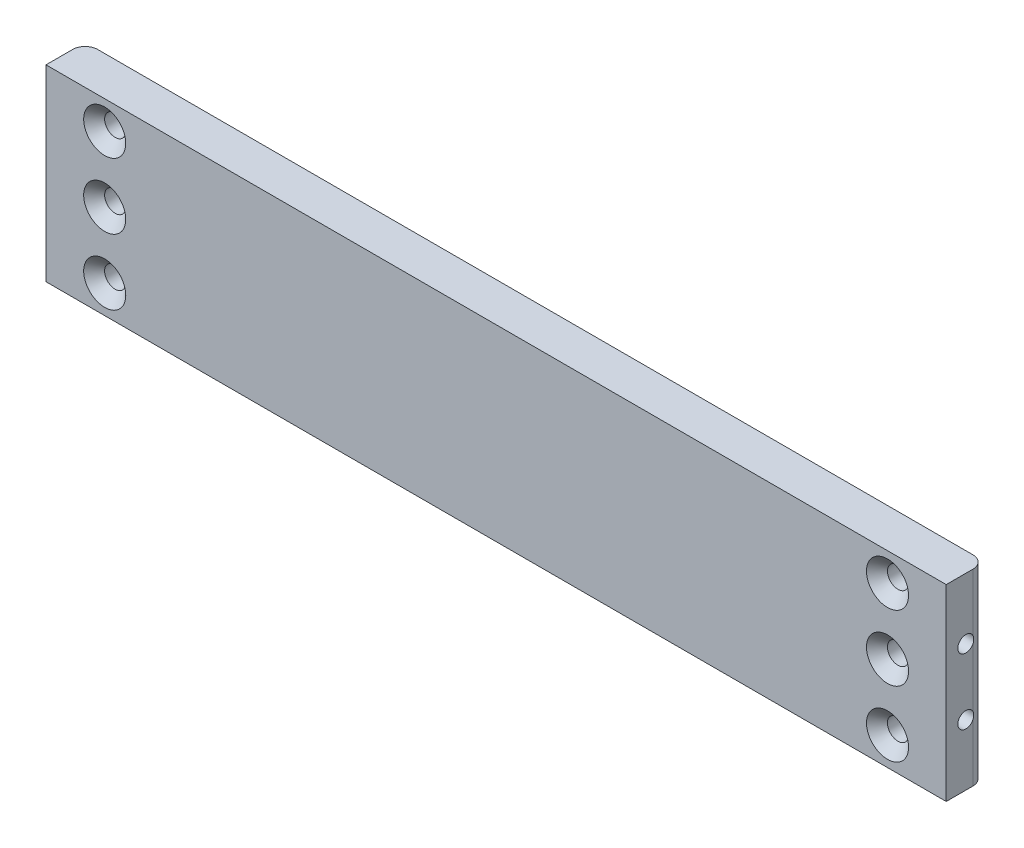
ISO-10303-21;
HEADER;
FILE_DESCRIPTION(('STEP AP214'),'2;1');
FILE_NAME('part.step','',(''),(''),'','','');
FILE_SCHEMA(('AUTOMOTIVE_DESIGN { 1 0 10303 214 1 1 1 1 }'));
ENDSEC;
DATA;
#1=APPLICATION_CONTEXT('core data for automotive mechanical design processes');
#2=APPLICATION_PROTOCOL_DEFINITION('international standard','automotive_design',2000,#1);
#3=PRODUCT_CONTEXT('',#1,'mechanical');
#4=PRODUCT('Part','Part','',(#3));
#5=PRODUCT_RELATED_PRODUCT_CATEGORY('part','',(#4));
#6=PRODUCT_DEFINITION_FORMATION('','',#4);
#7=PRODUCT_DEFINITION_CONTEXT('part definition',#1,'design');
#8=PRODUCT_DEFINITION('design','',#6,#7);
#9=PRODUCT_DEFINITION_SHAPE('','',#8);
#10=(LENGTH_UNIT() NAMED_UNIT(*) SI_UNIT(.MILLI.,.METRE.));
#11=(NAMED_UNIT(*) PLANE_ANGLE_UNIT() SI_UNIT($,.RADIAN.));
#12=(NAMED_UNIT(*) SI_UNIT($,.STERADIAN.) SOLID_ANGLE_UNIT());
#13=UNCERTAINTY_MEASURE_WITH_UNIT(LENGTH_MEASURE(1.E-05),#10,'distance_accuracy_value','');
#14=(GEOMETRIC_REPRESENTATION_CONTEXT(3) GLOBAL_UNCERTAINTY_ASSIGNED_CONTEXT((#13)) GLOBAL_UNIT_ASSIGNED_CONTEXT((#10,
#11,#12)) REPRESENTATION_CONTEXT('',''));
#15=CARTESIAN_POINT('',(0.,0.,0.));
#16=DIRECTION('',(0.,0.,1.));
#17=DIRECTION('',(1.,0.,0.));
#18=AXIS2_PLACEMENT_3D('',#15,#16,#17);
#19=CARTESIAN_POINT('',(-50.,120.,25.));
#20=DIRECTION('',(1.,0.,0.));
#21=DIRECTION('',(0.,0.,-1.));
#22=AXIS2_PLACEMENT_3D('',#19,#20,#21);
#23=PLANE('',#22);
#24=DIRECTION('',(0.,0.,-1.));
#25=VECTOR('',#24,1.);
#26=CARTESIAN_POINT('',(-50.,120.,25.));
#27=LINE('',#26,#25);
#28=CARTESIAN_POINT('',(-50.,120.,25.));
#29=VERTEX_POINT('',#28);
#30=CARTESIAN_POINT('',(-50.,120.,8.));
#31=VERTEX_POINT('',#30);
#32=EDGE_CURVE('E283',#29,#31,#27,.T.);
#33=ORIENTED_EDGE('',*,*,#32,.T.);
#34=DIRECTION('',(0.,-1.,0.));
#35=VECTOR('',#34,1.);
#36=CARTESIAN_POINT('',(-50.,120.,8.));
#37=LINE('',#36,#35);
#38=CARTESIAN_POINT('',(-50.,83.3999999999999,8.));
#39=VERTEX_POINT('',#38);
#40=EDGE_CURVE('E347',#31,#39,#37,.T.);
#41=ORIENTED_EDGE('',*,*,#40,.T.);
#42=CARTESIAN_POINT('',(-50.,80.9999999999999,12.5));
#43=DIRECTION('',(-1.,0.,0.));
#44=DIRECTION('',(0.,0.,1.));
#45=AXIS2_PLACEMENT_3D('',#42,#43,#44);
#46=CIRCLE('',#45,5.09999999999999);
#47=CARTESIAN_POINT('',(-50.,78.6,8.));
#48=VERTEX_POINT('',#47);
#49=EDGE_CURVE('E162',#48,#39,#46,.T.);
#50=ORIENTED_EDGE('',*,*,#49,.F.);
#51=DIRECTION('',(0.,-1.,0.));
#52=VECTOR('',#51,1.);
#53=CARTESIAN_POINT('',(-50.,120.,8.));
#54=LINE('',#53,#52);
#55=CARTESIAN_POINT('',(-50.,41.4,8.));
#56=VERTEX_POINT('',#55);
#57=EDGE_CURVE('E70',#48,#56,#54,.T.);
#58=ORIENTED_EDGE('',*,*,#57,.T.);
#59=CARTESIAN_POINT('',(-50.,39.,12.5));
#60=DIRECTION('',(-1.,0.,0.));
#61=DIRECTION('',(0.,0.,1.));
#62=AXIS2_PLACEMENT_3D('',#59,#60,#61);
#63=CIRCLE('',#62,5.09999999999999);
#64=CARTESIAN_POINT('',(-50.,36.6,8.));
#65=VERTEX_POINT('',#64);
#66=EDGE_CURVE('E170',#65,#56,#63,.T.);
#67=ORIENTED_EDGE('',*,*,#66,.F.);
#68=DIRECTION('',(0.,-1.,0.));
#69=VECTOR('',#68,1.);
#70=CARTESIAN_POINT('',(-50.,120.,8.));
#71=LINE('',#70,#69);
#72=CARTESIAN_POINT('',(-50.,0.,8.));
#73=VERTEX_POINT('',#72);
#74=EDGE_CURVE('E353',#65,#73,#71,.T.);
#75=ORIENTED_EDGE('',*,*,#74,.T.);
#76=DIRECTION('',(0.,0.,-1.));
#77=VECTOR('',#76,1.);
#78=CARTESIAN_POINT('',(-50.,0.,25.));
#79=LINE('',#78,#77);
#80=CARTESIAN_POINT('',(-50.,0.,25.));
#81=VERTEX_POINT('',#80);
#82=EDGE_CURVE('E279',#81,#73,#79,.T.);
#83=ORIENTED_EDGE('',*,*,#82,.F.);
#84=DIRECTION('',(0.,-1.,0.));
#85=VECTOR('',#84,1.);
#86=CARTESIAN_POINT('',(-50.,120.,25.));
#87=LINE('',#86,#85);
#88=EDGE_CURVE('E254',#29,#81,#87,.T.);
#89=ORIENTED_EDGE('',*,*,#88,.F.);
#90=EDGE_LOOP('',(#33,#41,#50,#58,#67,#75,#83,#89));
#91=FACE_BOUND('',#90,.T.);
#92=ADVANCED_FACE('F44',(#91),#23,.F.);
#93=CARTESIAN_POINT('',(525.,0.,25.));
#94=DIRECTION('',(0.,-1.,0.));
#95=DIRECTION('',(1.,0.,0.));
#96=AXIS2_PLACEMENT_3D('',#93,#94,#95);
#97=PLANE('',#96);
#98=DIRECTION('',(-1.,0.,0.));
#99=VECTOR('',#98,1.);
#100=CARTESIAN_POINT('',(525.,0.,0.));
#101=LINE('',#100,#99);
#102=CARTESIAN_POINT('',(517.,0.,0.));
#103=VERTEX_POINT('',#102);
#104=CARTESIAN_POINT('',(-42.,0.,0.));
#105=VERTEX_POINT('',#104);
#106=EDGE_CURVE('E249',#103,#105,#101,.T.);
#107=ORIENTED_EDGE('',*,*,#106,.F.);
#108=CARTESIAN_POINT('',(517.,0.,8.));
#109=DIRECTION('',(0.,-1.,0.));
#110=DIRECTION('',(1.,0.,0.));
#111=AXIS2_PLACEMENT_3D('',#108,#109,#110);
#112=CIRCLE('',#111,8.);
#113=CARTESIAN_POINT('',(525.,0.,8.));
#114=VERTEX_POINT('',#113);
#115=EDGE_CURVE('E297',#103,#114,#112,.T.);
#116=ORIENTED_EDGE('',*,*,#115,.T.);
#117=DIRECTION('',(0.,0.,-1.));
#118=VECTOR('',#117,1.);
#119=CARTESIAN_POINT('',(525.,0.,25.));
#120=LINE('',#119,#118);
#121=CARTESIAN_POINT('',(525.,0.,25.));
#122=VERTEX_POINT('',#121);
#123=EDGE_CURVE('E275',#122,#114,#120,.T.);
#124=ORIENTED_EDGE('',*,*,#123,.F.);
#125=DIRECTION('',(1.,0.,0.));
#126=VECTOR('',#125,1.);
#127=CARTESIAN_POINT('',(-50.,0.,25.));
#128=LINE('',#127,#126);
#129=EDGE_CURVE('E258',#81,#122,#128,.T.);
#130=ORIENTED_EDGE('',*,*,#129,.F.);
#131=ORIENTED_EDGE('',*,*,#82,.T.);
#132=CARTESIAN_POINT('',(-42.,0.,8.));
#133=DIRECTION('',(0.,-1.,0.));
#134=DIRECTION('',(1.,0.,0.));
#135=AXIS2_PLACEMENT_3D('',#132,#133,#134);
#136=CIRCLE('',#135,8.);
#137=EDGE_CURVE('E294',#73,#105,#136,.T.);
#138=ORIENTED_EDGE('',*,*,#137,.T.);
#139=EDGE_LOOP('',(#107,#116,#124,#130,#131,#138));
#140=FACE_BOUND('',#139,.T.);
#141=ADVANCED_FACE('F395',(#140),#97,.T.);
#142=CARTESIAN_POINT('',(525.,120.,25.));
#143=DIRECTION('',(1.,0.,0.));
#144=DIRECTION('',(0.,0.,-1.));
#145=AXIS2_PLACEMENT_3D('',#142,#143,#144);
#146=PLANE('',#145);
#147=ORIENTED_EDGE('',*,*,#123,.T.);
#148=DIRECTION('',(0.,-1.,0.));
#149=VECTOR('',#148,1.);
#150=CARTESIAN_POINT('',(525.,120.,8.));
#151=LINE('',#150,#149);
#152=CARTESIAN_POINT('',(525.,36.6,8.));
#153=VERTEX_POINT('',#152);
#154=EDGE_CURVE('E306',#114,#153,#151,.F.);
#155=ORIENTED_EDGE('',*,*,#154,.T.);
#156=CARTESIAN_POINT('',(525.,39.,12.5));
#157=DIRECTION('',(1.,0.,0.));
#158=DIRECTION('',(0.,0.,-1.));
#159=AXIS2_PLACEMENT_3D('',#156,#157,#158);
#160=CIRCLE('',#159,5.09999999999999);
#161=CARTESIAN_POINT('',(525.,41.4,8.));
#162=VERTEX_POINT('',#161);
#163=EDGE_CURVE('E148',#162,#153,#160,.T.);
#164=ORIENTED_EDGE('',*,*,#163,.F.);
#165=DIRECTION('',(0.,-1.,0.));
#166=VECTOR('',#165,1.);
#167=CARTESIAN_POINT('',(525.,120.,8.));
#168=LINE('',#167,#166);
#169=CARTESIAN_POINT('',(525.,78.6,8.));
#170=VERTEX_POINT('',#169);
#171=EDGE_CURVE('E303',#162,#170,#168,.F.);
#172=ORIENTED_EDGE('',*,*,#171,.T.);
#173=CARTESIAN_POINT('',(525.,80.9999999999999,12.5));
#174=DIRECTION('',(1.,0.,0.));
#175=DIRECTION('',(0.,0.,-1.));
#176=AXIS2_PLACEMENT_3D('',#173,#174,#175);
#177=CIRCLE('',#176,5.09999999999999);
#178=CARTESIAN_POINT('',(525.,83.3999999999999,8.));
#179=VERTEX_POINT('',#178);
#180=EDGE_CURVE('E149',#179,#170,#177,.T.);
#181=ORIENTED_EDGE('',*,*,#180,.F.);
#182=DIRECTION('',(0.,-1.,0.));
#183=VECTOR('',#182,1.);
#184=CARTESIAN_POINT('',(525.,120.,8.));
#185=LINE('',#184,#183);
#186=CARTESIAN_POINT('',(525.,120.,8.));
#187=VERTEX_POINT('',#186);
#188=EDGE_CURVE('E300',#179,#187,#185,.F.);
#189=ORIENTED_EDGE('',*,*,#188,.T.);
#190=DIRECTION('',(0.,0.,-1.));
#191=VECTOR('',#190,1.);
#192=CARTESIAN_POINT('',(525.,120.,25.));
#193=LINE('',#192,#191);
#194=CARTESIAN_POINT('',(525.,120.,25.));
#195=VERTEX_POINT('',#194);
#196=EDGE_CURVE('E265',#195,#187,#193,.T.);
#197=ORIENTED_EDGE('',*,*,#196,.F.);
#198=DIRECTION('',(0.,-1.,0.));
#199=VECTOR('',#198,1.);
#200=CARTESIAN_POINT('',(525.,120.,25.));
#201=LINE('',#200,#199);
#202=EDGE_CURVE('E261',#195,#122,#201,.T.);
#203=ORIENTED_EDGE('',*,*,#202,.T.);
#204=EDGE_LOOP('',(#147,#155,#164,#172,#181,#189,#197,#203));
#205=FACE_BOUND('',#204,.T.);
#206=ADVANCED_FACE('F372',(#205),#146,.T.);
#207=CARTESIAN_POINT('',(-25.,120.,25.));
#208=DIRECTION('',(0.,1.,0.));
#209=DIRECTION('',(-1.,0.,0.));
#210=AXIS2_PLACEMENT_3D('',#207,#208,#209);
#211=PLANE('',#210);
#212=ORIENTED_EDGE('',*,*,#196,.T.);
#213=CARTESIAN_POINT('',(517.,120.,8.));
#214=DIRECTION('',(0.,1.,0.));
#215=DIRECTION('',(-1.,0.,0.));
#216=AXIS2_PLACEMENT_3D('',#213,#214,#215);
#217=CIRCLE('',#216,8.);
#218=CARTESIAN_POINT('',(517.,120.,0.));
#219=VERTEX_POINT('',#218);
#220=EDGE_CURVE('E356',#187,#219,#217,.T.);
#221=ORIENTED_EDGE('',*,*,#220,.T.);
#222=DIRECTION('',(1.,0.,0.));
#223=VECTOR('',#222,1.);
#224=CARTESIAN_POINT('',(-25.,120.,0.));
#225=LINE('',#224,#223);
#226=CARTESIAN_POINT('',(-42.,120.,0.));
#227=VERTEX_POINT('',#226);
#228=EDGE_CURVE('E255',#227,#219,#225,.T.);
#229=ORIENTED_EDGE('',*,*,#228,.F.);
#230=CARTESIAN_POINT('',(-42.,120.,8.));
#231=DIRECTION('',(0.,1.,0.));
#232=DIRECTION('',(-1.,0.,0.));
#233=AXIS2_PLACEMENT_3D('',#230,#231,#232);
#234=CIRCLE('',#233,8.);
#235=EDGE_CURVE('E358',#227,#31,#234,.T.);
#236=ORIENTED_EDGE('',*,*,#235,.T.);
#237=ORIENTED_EDGE('',*,*,#32,.F.);
#238=DIRECTION('',(-1.,0.,0.));
#239=VECTOR('',#238,1.);
#240=CARTESIAN_POINT('',(-25.,120.,25.));
#241=LINE('',#240,#239);
#242=EDGE_CURVE('E250',#195,#29,#241,.T.);
#243=ORIENTED_EDGE('',*,*,#242,.F.);
#244=EDGE_LOOP('',(#212,#221,#229,#236,#237,#243));
#245=FACE_BOUND('',#244,.T.);
#246=ADVANCED_FACE('F378',(#245),#211,.T.);
#247=CARTESIAN_POINT('',(0.,0.,25.));
#248=DIRECTION('',(0.,0.,1.));
#249=DIRECTION('',(1.,0.,0.));
#250=AXIS2_PLACEMENT_3D('',#247,#248,#249);
#251=PLANE('',#250);
#252=CARTESIAN_POINT('',(-12.5,102.,25.));
#253=DIRECTION('',(0.,0.,1.));
#254=DIRECTION('',(1.,0.,0.));
#255=AXIS2_PLACEMENT_3D('',#252,#253,#254);
#256=CIRCLE('',#255,13.44);
#257=CARTESIAN_POINT('',(0.94,102.,25.));
#258=VERTEX_POINT('',#257);
#259=EDGE_CURVE('E177',#258,#258,#256,.T.);
#260=ORIENTED_EDGE('',*,*,#259,.F.);
#261=EDGE_LOOP('',(#260));
#262=FACE_BOUND('',#261,.T.);
#263=CARTESIAN_POINT('',(-12.5,60.,25.));
#264=DIRECTION('',(0.,0.,1.));
#265=DIRECTION('',(1.,0.,0.));
#266=AXIS2_PLACEMENT_3D('',#263,#264,#265);
#267=CIRCLE('',#266,13.44);
#268=CARTESIAN_POINT('',(0.94,60.,25.));
#269=VERTEX_POINT('',#268);
#270=EDGE_CURVE('E189',#269,#269,#267,.T.);
#271=ORIENTED_EDGE('',*,*,#270,.F.);
#272=EDGE_LOOP('',(#271));
#273=FACE_BOUND('',#272,.T.);
#274=CARTESIAN_POINT('',(-12.5,17.9999999999999,25.));
#275=DIRECTION('',(0.,0.,1.));
#276=DIRECTION('',(1.,0.,0.));
#277=AXIS2_PLACEMENT_3D('',#274,#275,#276);
#278=CIRCLE('',#277,13.44);
#279=CARTESIAN_POINT('',(0.94,17.9999999999999,25.));
#280=VERTEX_POINT('',#279);
#281=EDGE_CURVE('E201',#280,#280,#278,.T.);
#282=ORIENTED_EDGE('',*,*,#281,.F.);
#283=EDGE_LOOP('',(#282));
#284=FACE_BOUND('',#283,.T.);
#285=CARTESIAN_POINT('',(487.5,102.,25.));
#286=DIRECTION('',(0.,0.,1.));
#287=DIRECTION('',(1.,0.,0.));
#288=AXIS2_PLACEMENT_3D('',#285,#286,#287);
#289=CIRCLE('',#288,13.44);
#290=CARTESIAN_POINT('',(500.94,102.,25.));
#291=VERTEX_POINT('',#290);
#292=EDGE_CURVE('E213',#291,#291,#289,.T.);
#293=ORIENTED_EDGE('',*,*,#292,.F.);
#294=EDGE_LOOP('',(#293));
#295=FACE_BOUND('',#294,.T.);
#296=CARTESIAN_POINT('',(487.5,60.0000000000001,25.));
#297=DIRECTION('',(0.,0.,1.));
#298=DIRECTION('',(1.,0.,0.));
#299=AXIS2_PLACEMENT_3D('',#296,#297,#298);
#300=CIRCLE('',#299,13.44);
#301=CARTESIAN_POINT('',(500.94,60.0000000000001,25.));
#302=VERTEX_POINT('',#301);
#303=EDGE_CURVE('E225',#302,#302,#300,.T.);
#304=ORIENTED_EDGE('',*,*,#303,.F.);
#305=EDGE_LOOP('',(#304));
#306=FACE_BOUND('',#305,.T.);
#307=CARTESIAN_POINT('',(487.5,18.0000000000001,25.));
#308=DIRECTION('',(0.,0.,1.));
#309=DIRECTION('',(1.,0.,0.));
#310=AXIS2_PLACEMENT_3D('',#307,#308,#309);
#311=CIRCLE('',#310,13.44);
#312=CARTESIAN_POINT('',(500.94,18.0000000000001,25.));
#313=VERTEX_POINT('',#312);
#314=EDGE_CURVE('E237',#313,#313,#311,.T.);
#315=ORIENTED_EDGE('',*,*,#314,.F.);
#316=EDGE_LOOP('',(#315));
#317=FACE_BOUND('',#316,.T.);
#318=ORIENTED_EDGE('',*,*,#242,.T.);
#319=ORIENTED_EDGE('',*,*,#88,.T.);
#320=ORIENTED_EDGE('',*,*,#129,.T.);
#321=ORIENTED_EDGE('',*,*,#202,.F.);
#322=EDGE_LOOP('',(#318,#319,#320,#321));
#323=FACE_BOUND('',#322,.T.);
#324=ADVANCED_FACE('F391',(#262,#273,#284,#295,#306,#317,#323),#251,.T.);
#325=CARTESIAN_POINT('',(0.,0.,0.));
#326=DIRECTION('',(0.,0.,1.));
#327=DIRECTION('',(1.,0.,0.));
#328=AXIS2_PLACEMENT_3D('',#325,#326,#327);
#329=PLANE('',#328);
#330=CARTESIAN_POINT('',(-12.5,102.,0.));
#331=DIRECTION('',(0.,0.,1.));
#332=DIRECTION('',(1.,0.,0.));
#333=AXIS2_PLACEMENT_3D('',#330,#331,#332);
#334=CIRCLE('',#333,6.74999999999999);
#335=CARTESIAN_POINT('',(-5.75000000000001,102.,0.));
#336=VERTEX_POINT('',#335);
#337=EDGE_CURVE('E185',#336,#336,#334,.T.);
#338=ORIENTED_EDGE('',*,*,#337,.T.);
#339=EDGE_LOOP('',(#338));
#340=FACE_BOUND('',#339,.T.);
#341=CARTESIAN_POINT('',(-12.5,60.,0.));
#342=DIRECTION('',(0.,0.,1.));
#343=DIRECTION('',(1.,0.,0.));
#344=AXIS2_PLACEMENT_3D('',#341,#342,#343);
#345=CIRCLE('',#344,6.74999999999999);
#346=CARTESIAN_POINT('',(-5.75000000000001,60.,0.));
#347=VERTEX_POINT('',#346);
#348=EDGE_CURVE('E197',#347,#347,#345,.T.);
#349=ORIENTED_EDGE('',*,*,#348,.T.);
#350=EDGE_LOOP('',(#349));
#351=FACE_BOUND('',#350,.T.);
#352=CARTESIAN_POINT('',(-12.5,17.9999999999999,0.));
#353=DIRECTION('',(0.,0.,1.));
#354=DIRECTION('',(1.,0.,0.));
#355=AXIS2_PLACEMENT_3D('',#352,#353,#354);
#356=CIRCLE('',#355,6.74999999999999);
#357=CARTESIAN_POINT('',(-5.75000000000001,17.9999999999999,0.));
#358=VERTEX_POINT('',#357);
#359=EDGE_CURVE('E209',#358,#358,#356,.T.);
#360=ORIENTED_EDGE('',*,*,#359,.T.);
#361=EDGE_LOOP('',(#360));
#362=FACE_BOUND('',#361,.T.);
#363=CARTESIAN_POINT('',(487.5,102.,0.));
#364=DIRECTION('',(0.,0.,1.));
#365=DIRECTION('',(1.,0.,0.));
#366=AXIS2_PLACEMENT_3D('',#363,#364,#365);
#367=CIRCLE('',#366,6.74999999999998);
#368=CARTESIAN_POINT('',(494.25,102.,0.));
#369=VERTEX_POINT('',#368);
#370=EDGE_CURVE('E221',#369,#369,#367,.T.);
#371=ORIENTED_EDGE('',*,*,#370,.T.);
#372=EDGE_LOOP('',(#371));
#373=FACE_BOUND('',#372,.T.);
#374=CARTESIAN_POINT('',(487.5,60.0000000000001,0.));
#375=DIRECTION('',(0.,0.,1.));
#376=DIRECTION('',(1.,0.,0.));
#377=AXIS2_PLACEMENT_3D('',#374,#375,#376);
#378=CIRCLE('',#377,6.74999999999998);
#379=CARTESIAN_POINT('',(494.25,60.0000000000001,0.));
#380=VERTEX_POINT('',#379);
#381=EDGE_CURVE('E233',#380,#380,#378,.T.);
#382=ORIENTED_EDGE('',*,*,#381,.T.);
#383=EDGE_LOOP('',(#382));
#384=FACE_BOUND('',#383,.T.);
#385=CARTESIAN_POINT('',(487.5,18.0000000000001,0.));
#386=DIRECTION('',(0.,0.,1.));
#387=DIRECTION('',(1.,0.,0.));
#388=AXIS2_PLACEMENT_3D('',#385,#386,#387);
#389=CIRCLE('',#388,6.74999999999998);
#390=CARTESIAN_POINT('',(494.25,18.0000000000001,0.));
#391=VERTEX_POINT('',#390);
#392=EDGE_CURVE('E245',#391,#391,#389,.T.);
#393=ORIENTED_EDGE('',*,*,#392,.T.);
#394=EDGE_LOOP('',(#393));
#395=FACE_BOUND('',#394,.T.);
#396=ORIENTED_EDGE('',*,*,#228,.T.);
#397=DIRECTION('',(0.,-1.,0.));
#398=VECTOR('',#397,1.);
#399=CARTESIAN_POINT('',(517.,0.,0.));
#400=LINE('',#399,#398);
#401=EDGE_CURVE('E290',#219,#103,#400,.T.);
#402=ORIENTED_EDGE('',*,*,#401,.T.);
#403=ORIENTED_EDGE('',*,*,#106,.T.);
#404=DIRECTION('',(0.,-1.,0.));
#405=VECTOR('',#404,1.);
#406=CARTESIAN_POINT('',(-42.,0.,0.));
#407=LINE('',#406,#405);
#408=EDGE_CURVE('E287',#105,#227,#407,.F.);
#409=ORIENTED_EDGE('',*,*,#408,.T.);
#410=EDGE_LOOP('',(#396,#402,#403,#409));
#411=FACE_BOUND('',#410,.T.);
#412=ADVANCED_FACE('F380',(#340,#351,#362,#373,#384,#395,#411),#329,.F.);
#413=CARTESIAN_POINT('',(487.5,18.0000000000001,25.));
#414=DIRECTION('',(0.,0.,1.));
#415=DIRECTION('',(1.,0.,0.));
#416=AXIS2_PLACEMENT_3D('',#413,#414,#415);
#417=CYLINDRICAL_SURFACE('',#416,6.74999999999998);
#418=ORIENTED_EDGE('',*,*,#392,.F.);
#419=EDGE_LOOP('',(#418));
#420=FACE_BOUND('',#419,.T.);
#421=CARTESIAN_POINT('',(487.5,18.0000000000001,18.31));
#422=DIRECTION('',(0.,0.,1.));
#423=DIRECTION('',(1.,0.,0.));
#424=AXIS2_PLACEMENT_3D('',#421,#422,#423);
#425=CIRCLE('',#424,6.74999999999998);
#426=CARTESIAN_POINT('',(494.25,18.0000000000001,18.31));
#427=VERTEX_POINT('',#426);
#428=EDGE_CURVE('E241',#427,#427,#425,.T.);
#429=ORIENTED_EDGE('',*,*,#428,.T.);
#430=EDGE_LOOP('',(#429));
#431=FACE_BOUND('',#430,.T.);
#432=ADVANCED_FACE('F426',(#420,#431),#417,.F.);
#433=CARTESIAN_POINT('',(487.5,18.0000000000001,25.));
#434=DIRECTION('',(0.,0.,1.));
#435=DIRECTION('',(1.,0.,0.));
#436=AXIS2_PLACEMENT_3D('',#433,#434,#435);
#437=CONICAL_SURFACE('',#436,13.44,0.785398163397446);
#438=ORIENTED_EDGE('',*,*,#428,.F.);
#439=EDGE_LOOP('',(#438));
#440=FACE_BOUND('',#439,.T.);
#441=ORIENTED_EDGE('',*,*,#314,.T.);
#442=EDGE_LOOP('',(#441));
#443=FACE_BOUND('',#442,.T.);
#444=ADVANCED_FACE('F433',(#440,#443),#437,.F.);
#445=CARTESIAN_POINT('',(487.5,60.0000000000001,25.));
#446=DIRECTION('',(0.,0.,1.));
#447=DIRECTION('',(1.,0.,0.));
#448=AXIS2_PLACEMENT_3D('',#445,#446,#447);
#449=CYLINDRICAL_SURFACE('',#448,6.74999999999998);
#450=ORIENTED_EDGE('',*,*,#381,.F.);
#451=EDGE_LOOP('',(#450));
#452=FACE_BOUND('',#451,.T.);
#453=CARTESIAN_POINT('',(487.5,60.0000000000001,18.31));
#454=DIRECTION('',(0.,0.,1.));
#455=DIRECTION('',(1.,0.,0.));
#456=AXIS2_PLACEMENT_3D('',#453,#454,#455);
#457=CIRCLE('',#456,6.74999999999998);
#458=CARTESIAN_POINT('',(494.25,60.0000000000001,18.31));
#459=VERTEX_POINT('',#458);
#460=EDGE_CURVE('E229',#459,#459,#457,.T.);
#461=ORIENTED_EDGE('',*,*,#460,.T.);
#462=EDGE_LOOP('',(#461));
#463=FACE_BOUND('',#462,.T.);
#464=ADVANCED_FACE('F437',(#452,#463),#449,.F.);
#465=CARTESIAN_POINT('',(487.5,60.0000000000001,25.));
#466=DIRECTION('',(0.,0.,1.));
#467=DIRECTION('',(1.,0.,0.));
#468=AXIS2_PLACEMENT_3D('',#465,#466,#467);
#469=CONICAL_SURFACE('',#468,13.44,0.785398163397446);
#470=ORIENTED_EDGE('',*,*,#460,.F.);
#471=EDGE_LOOP('',(#470));
#472=FACE_BOUND('',#471,.T.);
#473=ORIENTED_EDGE('',*,*,#303,.T.);
#474=EDGE_LOOP('',(#473));
#475=FACE_BOUND('',#474,.T.);
#476=ADVANCED_FACE('F441',(#472,#475),#469,.F.);
#477=CARTESIAN_POINT('',(487.5,102.,25.));
#478=DIRECTION('',(0.,0.,1.));
#479=DIRECTION('',(1.,0.,0.));
#480=AXIS2_PLACEMENT_3D('',#477,#478,#479);
#481=CYLINDRICAL_SURFACE('',#480,6.74999999999998);
#482=ORIENTED_EDGE('',*,*,#370,.F.);
#483=EDGE_LOOP('',(#482));
#484=FACE_BOUND('',#483,.T.);
#485=CARTESIAN_POINT('',(487.5,102.,18.31));
#486=DIRECTION('',(0.,0.,1.));
#487=DIRECTION('',(1.,0.,0.));
#488=AXIS2_PLACEMENT_3D('',#485,#486,#487);
#489=CIRCLE('',#488,6.74999999999998);
#490=CARTESIAN_POINT('',(494.25,102.,18.31));
#491=VERTEX_POINT('',#490);
#492=EDGE_CURVE('E217',#491,#491,#489,.T.);
#493=ORIENTED_EDGE('',*,*,#492,.T.);
#494=EDGE_LOOP('',(#493));
#495=FACE_BOUND('',#494,.T.);
#496=ADVANCED_FACE('F445',(#484,#495),#481,.F.);
#497=CARTESIAN_POINT('',(487.5,102.,25.));
#498=DIRECTION('',(0.,0.,1.));
#499=DIRECTION('',(1.,0.,0.));
#500=AXIS2_PLACEMENT_3D('',#497,#498,#499);
#501=CONICAL_SURFACE('',#500,13.44,0.785398163397446);
#502=ORIENTED_EDGE('',*,*,#492,.F.);
#503=EDGE_LOOP('',(#502));
#504=FACE_BOUND('',#503,.T.);
#505=ORIENTED_EDGE('',*,*,#292,.T.);
#506=EDGE_LOOP('',(#505));
#507=FACE_BOUND('',#506,.T.);
#508=ADVANCED_FACE('F449',(#504,#507),#501,.F.);
#509=CARTESIAN_POINT('',(-12.5,17.9999999999999,25.));
#510=DIRECTION('',(0.,0.,1.));
#511=DIRECTION('',(1.,0.,0.));
#512=AXIS2_PLACEMENT_3D('',#509,#510,#511);
#513=CYLINDRICAL_SURFACE('',#512,6.75);
#514=ORIENTED_EDGE('',*,*,#359,.F.);
#515=EDGE_LOOP('',(#514));
#516=FACE_BOUND('',#515,.T.);
#517=CARTESIAN_POINT('',(-12.5,17.9999999999999,18.31));
#518=DIRECTION('',(0.,0.,1.));
#519=DIRECTION('',(1.,0.,0.));
#520=AXIS2_PLACEMENT_3D('',#517,#518,#519);
#521=CIRCLE('',#520,6.75);
#522=CARTESIAN_POINT('',(-5.75,17.9999999999999,18.31));
#523=VERTEX_POINT('',#522);
#524=EDGE_CURVE('E205',#523,#523,#521,.T.);
#525=ORIENTED_EDGE('',*,*,#524,.T.);
#526=EDGE_LOOP('',(#525));
#527=FACE_BOUND('',#526,.T.);
#528=ADVANCED_FACE('F453',(#516,#527),#513,.F.);
#529=CARTESIAN_POINT('',(-12.5,17.9999999999999,25.));
#530=DIRECTION('',(0.,0.,1.));
#531=DIRECTION('',(1.,0.,0.));
#532=AXIS2_PLACEMENT_3D('',#529,#530,#531);
#533=CONICAL_SURFACE('',#532,13.44,0.785398163397449);
#534=ORIENTED_EDGE('',*,*,#524,.F.);
#535=EDGE_LOOP('',(#534));
#536=FACE_BOUND('',#535,.T.);
#537=ORIENTED_EDGE('',*,*,#281,.T.);
#538=EDGE_LOOP('',(#537));
#539=FACE_BOUND('',#538,.T.);
#540=ADVANCED_FACE('F457',(#536,#539),#533,.F.);
#541=CARTESIAN_POINT('',(-12.5,60.,25.));
#542=DIRECTION('',(0.,0.,1.));
#543=DIRECTION('',(1.,0.,0.));
#544=AXIS2_PLACEMENT_3D('',#541,#542,#543);
#545=CYLINDRICAL_SURFACE('',#544,6.75);
#546=ORIENTED_EDGE('',*,*,#348,.F.);
#547=EDGE_LOOP('',(#546));
#548=FACE_BOUND('',#547,.T.);
#549=CARTESIAN_POINT('',(-12.5,60.,18.31));
#550=DIRECTION('',(0.,0.,1.));
#551=DIRECTION('',(1.,0.,0.));
#552=AXIS2_PLACEMENT_3D('',#549,#550,#551);
#553=CIRCLE('',#552,6.75);
#554=CARTESIAN_POINT('',(-5.75,60.,18.31));
#555=VERTEX_POINT('',#554);
#556=EDGE_CURVE('E193',#555,#555,#553,.T.);
#557=ORIENTED_EDGE('',*,*,#556,.T.);
#558=EDGE_LOOP('',(#557));
#559=FACE_BOUND('',#558,.T.);
#560=ADVANCED_FACE('F461',(#548,#559),#545,.F.);
#561=CARTESIAN_POINT('',(-12.5,60.,25.));
#562=DIRECTION('',(0.,0.,1.));
#563=DIRECTION('',(1.,0.,0.));
#564=AXIS2_PLACEMENT_3D('',#561,#562,#563);
#565=CONICAL_SURFACE('',#564,13.44,0.785398163397449);
#566=ORIENTED_EDGE('',*,*,#556,.F.);
#567=EDGE_LOOP('',(#566));
#568=FACE_BOUND('',#567,.T.);
#569=ORIENTED_EDGE('',*,*,#270,.T.);
#570=EDGE_LOOP('',(#569));
#571=FACE_BOUND('',#570,.T.);
#572=ADVANCED_FACE('F465',(#568,#571),#565,.F.);
#573=CARTESIAN_POINT('',(-12.5,102.,25.));
#574=DIRECTION('',(0.,0.,1.));
#575=DIRECTION('',(1.,0.,0.));
#576=AXIS2_PLACEMENT_3D('',#573,#574,#575);
#577=CYLINDRICAL_SURFACE('',#576,6.75);
#578=ORIENTED_EDGE('',*,*,#337,.F.);
#579=EDGE_LOOP('',(#578));
#580=FACE_BOUND('',#579,.T.);
#581=CARTESIAN_POINT('',(-12.5,102.,18.31));
#582=DIRECTION('',(0.,0.,1.));
#583=DIRECTION('',(1.,0.,0.));
#584=AXIS2_PLACEMENT_3D('',#581,#582,#583);
#585=CIRCLE('',#584,6.75);
#586=CARTESIAN_POINT('',(-5.75,102.,18.31));
#587=VERTEX_POINT('',#586);
#588=EDGE_CURVE('E181',#587,#587,#585,.T.);
#589=ORIENTED_EDGE('',*,*,#588,.T.);
#590=EDGE_LOOP('',(#589));
#591=FACE_BOUND('',#590,.T.);
#592=ADVANCED_FACE('F469',(#580,#591),#577,.F.);
#593=CARTESIAN_POINT('',(-12.5,102.,25.));
#594=DIRECTION('',(0.,0.,1.));
#595=DIRECTION('',(1.,0.,0.));
#596=AXIS2_PLACEMENT_3D('',#593,#594,#595);
#597=CONICAL_SURFACE('',#596,13.44,0.785398163397449);
#598=ORIENTED_EDGE('',*,*,#588,.F.);
#599=EDGE_LOOP('',(#598));
#600=FACE_BOUND('',#599,.T.);
#601=ORIENTED_EDGE('',*,*,#259,.T.);
#602=EDGE_LOOP('',(#601));
#603=FACE_BOUND('',#602,.T.);
#604=ADVANCED_FACE('F409',(#600,#603),#597,.F.);
#605=CARTESIAN_POINT('',(0.,39.,12.5));
#606=DIRECTION('',(-1.,0.,0.));
#607=DIRECTION('',(0.,0.,1.));
#608=AXIS2_PLACEMENT_3D('',#605,#606,#607);
#609=CONICAL_SURFACE('',#608,5.09999999999999,1.02974425867665);
#610=CARTESIAN_POINT('',(3.06438915704056,39.,12.5));
#611=VERTEX_POINT('',#610);
#612=VERTEX_LOOP('',#611);
#613=FACE_BOUND('',#612,.T.);
#614=CARTESIAN_POINT('',(0.,39.,12.5));
#615=DIRECTION('',(-1.,0.,0.));
#616=DIRECTION('',(0.,0.,1.));
#617=AXIS2_PLACEMENT_3D('',#614,#615,#616);
#618=CIRCLE('',#617,5.09999999999999);
#619=CARTESIAN_POINT('',(0.,39.,17.6));
#620=VERTEX_POINT('',#619);
#621=EDGE_CURVE('E173',#620,#620,#618,.T.);
#622=ORIENTED_EDGE('',*,*,#621,.T.);
#623=EDGE_LOOP('',(#622));
#624=FACE_BOUND('',#623,.T.);
#625=ADVANCED_FACE('F400',(#613,#624),#609,.F.);
#626=CARTESIAN_POINT('',(-50.,39.,12.5));
#627=DIRECTION('',(-1.,0.,0.));
#628=DIRECTION('',(0.,0.,1.));
#629=AXIS2_PLACEMENT_3D('',#626,#627,#628);
#630=CYLINDRICAL_SURFACE('',#629,5.09999999999999);
#631=ORIENTED_EDGE('',*,*,#621,.F.);
#632=EDGE_LOOP('',(#631));
#633=FACE_BOUND('',#632,.T.);
#634=ORIENTED_EDGE('',*,*,#66,.T.);
#635=CARTESIAN_POINT('',(-50.,41.4,8.));
#636=CARTESIAN_POINT('',(-49.999980993121,41.2734731923745,7.93250177385756));
#637=CARTESIAN_POINT('',(-49.9991447112637,41.1440929842478,7.87037052815985));
#638=CARTESIAN_POINT('',(-49.9965207241126,40.8805782594042,7.75722202307094));
#639=CARTESIAN_POINT('',(-49.99473307721,40.7464440349428,7.70620408185693));
#640=CARTESIAN_POINT('',(-49.9908918815006,40.474539576339,7.6157142599907));
#641=CARTESIAN_POINT('',(-49.9888386907605,40.3367744338771,7.57622706041475));
#642=CARTESIAN_POINT('',(-49.9849885307004,40.0584092720851,7.50898121132363));
#643=CARTESIAN_POINT('',(-49.9831915572536,39.9178092984563,7.48122237288912));
#644=CARTESIAN_POINT('',(-49.9802383398078,39.6346798687358,7.43761810084007));
#645=CARTESIAN_POINT('',(-49.9790824834881,39.4921492984664,7.42177987347945));
#646=CARTESIAN_POINT('',(-49.9776361163798,39.2061903401433,7.40215400286866));
#647=CARTESIAN_POINT('',(-49.9773460022008,39.0627615707525,7.39837188264996));
#648=CARTESIAN_POINT('',(-49.9776861918653,38.7761272592172,7.40290058929696));
#649=CARTESIAN_POINT('',(-49.9783163030493,38.6329216766294,7.41120888489743));
#650=CARTESIAN_POINT('',(-49.9803781645194,38.3477902097916,7.43984773424711));
#651=CARTESIAN_POINT('',(-49.9818095275189,38.2058637409298,7.46017248008854));
#652=CARTESIAN_POINT('',(-49.9850292593995,37.9374184897657,7.51023240597638));
#653=CARTESIAN_POINT('',(-49.9867716977222,37.8107005083733,7.53890924023085));
#654=CARTESIAN_POINT('',(-49.9903542380428,37.5598293110105,7.6058441078961));
#655=CARTESIAN_POINT('',(-49.9921943328114,37.4356759061322,7.64410143285993));
#656=CARTESIAN_POINT('',(-49.9955592493781,37.1905597318628,7.73001086636048));
#657=CARTESIAN_POINT('',(-49.9970838463854,37.0695992906151,7.77766962648077));
#658=CARTESIAN_POINT('',(-49.9992980069127,36.831645112616,7.88208398676136));
#659=CARTESIAN_POINT('',(-49.9999874641112,36.714651882772,7.93884074414476));
#660=CARTESIAN_POINT('',(-50.,36.6,8.00000000000001));
#661=B_SPLINE_CURVE_WITH_KNOTS('',3,(#635,#636,#637,#638,#639,#640,#641,#642,#643,#644,#645,
#646,#647,#648,#649,#650,#651,#652,#653,#654,#655,#656,#657,#658,#659,#660),.UNSPECIFIED.,.F.,
.F.,(4,2,2,2,2,2,2,2,2,2,2,2,4),(0.,0.430074383777585,0.860122374220537,1.2895964066993,
1.71906352098691,2.1487900488887,2.57871341083251,3.00854677640907,3.43817256037973,
3.82760276924259,4.21700418947371,4.60668210859145,4.99640963232209),.UNSPECIFIED.);
#662=EDGE_CURVE('E11',#56,#65,#661,.T.);
#663=ORIENTED_EDGE('',*,*,#662,.T.);
#664=EDGE_LOOP('',(#634,#663));
#665=FACE_BOUND('',#664,.T.);
#666=ADVANCED_FACE('F398',(#633,#665),#630,.F.);
#667=CARTESIAN_POINT('',(0.,80.9999999999999,12.5));
#668=DIRECTION('',(-1.,0.,0.));
#669=DIRECTION('',(0.,0.,1.));
#670=AXIS2_PLACEMENT_3D('',#667,#668,#669);
#671=CONICAL_SURFACE('',#670,5.09999999999999,1.02974425867665);
#672=CARTESIAN_POINT('',(3.06438915704056,80.9999999999999,12.5));
#673=VERTEX_POINT('',#672);
#674=VERTEX_LOOP('',#673);
#675=FACE_BOUND('',#674,.T.);
#676=CARTESIAN_POINT('',(0.,80.9999999999999,12.5));
#677=DIRECTION('',(-1.,0.,0.));
#678=DIRECTION('',(0.,0.,1.));
#679=AXIS2_PLACEMENT_3D('',#676,#677,#678);
#680=CIRCLE('',#679,5.09999999999999);
#681=CARTESIAN_POINT('',(0.,80.9999999999999,17.6));
#682=VERTEX_POINT('',#681);
#683=EDGE_CURVE('E166',#682,#682,#680,.T.);
#684=ORIENTED_EDGE('',*,*,#683,.T.);
#685=EDGE_LOOP('',(#684));
#686=FACE_BOUND('',#685,.T.);
#687=ADVANCED_FACE('F339',(#675,#686),#671,.F.);
#688=CARTESIAN_POINT('',(-50.,80.9999999999999,12.5));
#689=DIRECTION('',(-1.,0.,0.));
#690=DIRECTION('',(0.,0.,1.));
#691=AXIS2_PLACEMENT_3D('',#688,#689,#690);
#692=CYLINDRICAL_SURFACE('',#691,5.09999999999999);
#693=ORIENTED_EDGE('',*,*,#683,.F.);
#694=EDGE_LOOP('',(#693));
#695=FACE_BOUND('',#694,.T.);
#696=ORIENTED_EDGE('',*,*,#49,.T.);
#697=CARTESIAN_POINT('',(-50.,83.3999999999999,8.));
#698=CARTESIAN_POINT('',(-49.999980993121,83.2734731923744,7.93250177385756));
#699=CARTESIAN_POINT('',(-49.9991447112637,83.1440929842477,7.87037052815985));
#700=CARTESIAN_POINT('',(-49.9965207241126,82.8805782594041,7.75722202307094));
#701=CARTESIAN_POINT('',(-49.99473307721,82.7464440349427,7.70620408185693));
#702=CARTESIAN_POINT('',(-49.9908918815006,82.474539576339,7.6157142599907));
#703=CARTESIAN_POINT('',(-49.9888386907605,82.3367744338771,7.57622706041475));
#704=CARTESIAN_POINT('',(-49.9849885307004,82.058409272085,7.50898121132363));
#705=CARTESIAN_POINT('',(-49.9831915572536,81.9178092984563,7.48122237288912));
#706=CARTESIAN_POINT('',(-49.9802383398078,81.6346798687358,7.43761810084006));
#707=CARTESIAN_POINT('',(-49.9790824834881,81.4921492984664,7.42177987347944));
#708=CARTESIAN_POINT('',(-49.9776361163798,81.2061903401433,7.40215400286865));
#709=CARTESIAN_POINT('',(-49.9773460022008,81.0627615707524,7.39837188264996));
#710=CARTESIAN_POINT('',(-49.9776861918653,80.7761272592171,7.40290058929696));
#711=CARTESIAN_POINT('',(-49.9783163030493,80.6329216766293,7.41120888489743));
#712=CARTESIAN_POINT('',(-49.9803781645194,80.3477902097916,7.43984773424711));
#713=CARTESIAN_POINT('',(-49.9818095275189,80.2058637409297,7.46017248008854));
#714=CARTESIAN_POINT('',(-49.9850292593995,79.9374184897657,7.51023240597637));
#715=CARTESIAN_POINT('',(-49.9867716977222,79.8107005083733,7.53890924023085));
#716=CARTESIAN_POINT('',(-49.9903542380428,79.5598293110104,7.6058441078961));
#717=CARTESIAN_POINT('',(-49.9921943328114,79.4356759061321,7.64410143285993));
#718=CARTESIAN_POINT('',(-49.9955592493781,79.1905597318628,7.73001086636047));
#719=CARTESIAN_POINT('',(-49.9970838463854,79.0695992906151,7.77766962648077));
#720=CARTESIAN_POINT('',(-49.9992980069127,78.8316451126159,7.88208398676136));
#721=CARTESIAN_POINT('',(-49.9999874641112,78.7146518827719,7.93884074414476));
#722=CARTESIAN_POINT('',(-50.,78.6,8.));
#723=B_SPLINE_CURVE_WITH_KNOTS('',3,(#697,#698,#699,#700,#701,#702,#703,#704,#705,#706,#707,
#708,#709,#710,#711,#712,#713,#714,#715,#716,#717,#718,#719,#720,#721,#722),.UNSPECIFIED.,.F.,
.F.,(4,2,2,2,2,2,2,2,2,2,2,2,4),(0.,0.430074383777585,0.86012237422053,1.2895964066993,
1.71906352098691,2.1487900488887,2.57871341083252,3.00854677640907,3.43817256037973,
3.82760276924259,4.21700418947371,4.60668210859146,4.99640963232209),.UNSPECIFIED.);
#724=EDGE_CURVE('E59',#39,#48,#723,.T.);
#725=ORIENTED_EDGE('',*,*,#724,.T.);
#726=EDGE_LOOP('',(#696,#725));
#727=FACE_BOUND('',#726,.T.);
#728=ADVANCED_FACE('F334',(#695,#727),#692,.F.);
#729=CARTESIAN_POINT('',(475.,39.,12.5));
#730=DIRECTION('',(1.,0.,0.));
#731=DIRECTION('',(0.,0.,-1.));
#732=AXIS2_PLACEMENT_3D('',#729,#730,#731);
#733=CONICAL_SURFACE('',#732,5.09999999999999,1.02974425867665);
#734=CARTESIAN_POINT('',(471.935610842959,39.,12.5));
#735=VERTEX_POINT('',#734);
#736=VERTEX_LOOP('',#735);
#737=FACE_BOUND('',#736,.T.);
#738=CARTESIAN_POINT('',(475.,39.,12.5));
#739=DIRECTION('',(1.,0.,0.));
#740=DIRECTION('',(0.,0.,-1.));
#741=AXIS2_PLACEMENT_3D('',#738,#739,#740);
#742=CIRCLE('',#741,5.09999999999999);
#743=CARTESIAN_POINT('',(475.,39.,7.40000000000001));
#744=VERTEX_POINT('',#743);
#745=EDGE_CURVE('E154',#744,#744,#742,.T.);
#746=ORIENTED_EDGE('',*,*,#745,.T.);
#747=EDGE_LOOP('',(#746));
#748=FACE_BOUND('',#747,.T.);
#749=ADVANCED_FACE('F330',(#737,#748),#733,.F.);
#750=CARTESIAN_POINT('',(525.,39.,12.5));
#751=DIRECTION('',(1.,0.,0.));
#752=DIRECTION('',(0.,0.,-1.));
#753=AXIS2_PLACEMENT_3D('',#750,#751,#752);
#754=CYLINDRICAL_SURFACE('',#753,5.09999999999999);
#755=ORIENTED_EDGE('',*,*,#745,.F.);
#756=EDGE_LOOP('',(#755));
#757=FACE_BOUND('',#756,.T.);
#758=ORIENTED_EDGE('',*,*,#163,.T.);
#759=CARTESIAN_POINT('',(525.,36.6,8.));
#760=CARTESIAN_POINT('',(524.999980993121,36.7265268076255,7.93250177385756));
#761=CARTESIAN_POINT('',(524.999144711264,36.8559070157522,7.87037052815985));
#762=CARTESIAN_POINT('',(524.996520724113,37.1194217405958,7.75722202307094));
#763=CARTESIAN_POINT('',(524.99473307721,37.2535559650572,7.70620408185693));
#764=CARTESIAN_POINT('',(524.9908918815,37.525460423661,7.6157142599907));
#765=CARTESIAN_POINT('',(524.98883869076,37.6632255661229,7.57622706041475));
#766=CARTESIAN_POINT('',(524.9849885307,37.9415907279149,7.50898121132363));
#767=CARTESIAN_POINT('',(524.983191557254,38.0821907015437,7.48122237288912));
#768=CARTESIAN_POINT('',(524.980238339808,38.3653201312641,7.43761810084007));
#769=CARTESIAN_POINT('',(524.979082483488,38.5078507015336,7.42177987347945));
#770=CARTESIAN_POINT('',(524.97763611638,38.7938096598566,7.40215400286866));
#771=CARTESIAN_POINT('',(524.977346002201,38.9372384292475,7.39837188264996));
#772=CARTESIAN_POINT('',(524.977686191865,39.2238727407828,7.40290058929696));
#773=CARTESIAN_POINT('',(524.978316303049,39.3670783233706,7.41120888489743));
#774=CARTESIAN_POINT('',(524.980378164519,39.6522097902084,7.43984773424711));
#775=CARTESIAN_POINT('',(524.981809527519,39.7941362590702,7.46017248008854));
#776=CARTESIAN_POINT('',(524.985029259399,40.0625815102342,7.51023240597638));
#777=CARTESIAN_POINT('',(524.986771697722,40.1892994916266,7.53890924023085));
#778=CARTESIAN_POINT('',(524.990354238043,40.4401706889895,7.6058441078961));
#779=CARTESIAN_POINT('',(524.992194332811,40.5643240938678,7.64410143285993));
#780=CARTESIAN_POINT('',(524.995559249378,40.8094402681372,7.73001086636048));
#781=CARTESIAN_POINT('',(524.997083846385,40.9304007093849,7.77766962648077));
#782=CARTESIAN_POINT('',(524.999298006913,41.168354887384,7.88208398676136));
#783=CARTESIAN_POINT('',(524.999987464111,41.285348117228,7.93884074414476));
#784=CARTESIAN_POINT('',(525.,41.4,8.00000000000001));
#785=B_SPLINE_CURVE_WITH_KNOTS('',3,(#759,#760,#761,#762,#763,#764,#765,#766,#767,#768,#769,
#770,#771,#772,#773,#774,#775,#776,#777,#778,#779,#780,#781,#782,#783,#784),.UNSPECIFIED.,.F.,
.F.,(4,2,2,2,2,2,2,2,2,2,2,2,4),(0.,0.430074383777585,0.860122374220538,1.2895964066993,
1.71906352098691,2.14879004888869,2.5787134108325,3.00854677640908,3.43817256037973,
3.82760276924258,4.21700418947371,4.60668210859146,4.99640963232209),.UNSPECIFIED.);
#786=EDGE_CURVE('E309',#153,#162,#785,.T.);
#787=ORIENTED_EDGE('',*,*,#786,.T.);
#788=EDGE_LOOP('',(#758,#787));
#789=FACE_BOUND('',#788,.T.);
#790=ADVANCED_FACE('F141',(#757,#789),#754,.F.);
#791=CARTESIAN_POINT('',(475.,80.9999999999999,12.5));
#792=DIRECTION('',(1.,0.,0.));
#793=DIRECTION('',(0.,0.,-1.));
#794=AXIS2_PLACEMENT_3D('',#791,#792,#793);
#795=CONICAL_SURFACE('',#794,5.09999999999999,1.02974425867665);
#796=CARTESIAN_POINT('',(471.935610842959,80.9999999999999,12.5));
#797=VERTEX_POINT('',#796);
#798=VERTEX_LOOP('',#797);
#799=FACE_BOUND('',#798,.T.);
#800=CARTESIAN_POINT('',(475.,80.9999999999999,12.5));
#801=DIRECTION('',(1.,0.,0.));
#802=DIRECTION('',(0.,0.,-1.));
#803=AXIS2_PLACEMENT_3D('',#800,#801,#802);
#804=CIRCLE('',#803,5.09999999999999);
#805=CARTESIAN_POINT('',(475.,80.9999999999999,7.40000000000001));
#806=VERTEX_POINT('',#805);
#807=EDGE_CURVE('E145',#806,#806,#804,.T.);
#808=ORIENTED_EDGE('',*,*,#807,.T.);
#809=EDGE_LOOP('',(#808));
#810=FACE_BOUND('',#809,.T.);
#811=ADVANCED_FACE('F137',(#799,#810),#795,.F.);
#812=CARTESIAN_POINT('',(525.,80.9999999999999,12.5));
#813=DIRECTION('',(1.,0.,0.));
#814=DIRECTION('',(0.,0.,-1.));
#815=AXIS2_PLACEMENT_3D('',#812,#813,#814);
#816=CYLINDRICAL_SURFACE('',#815,5.09999999999999);
#817=ORIENTED_EDGE('',*,*,#807,.F.);
#818=EDGE_LOOP('',(#817));
#819=FACE_BOUND('',#818,.T.);
#820=ORIENTED_EDGE('',*,*,#180,.T.);
#821=CARTESIAN_POINT('',(525.,78.6,8.));
#822=CARTESIAN_POINT('',(524.999980993121,78.7265268076255,7.93250177385756));
#823=CARTESIAN_POINT('',(524.999144711264,78.8559070157521,7.87037052815985));
#824=CARTESIAN_POINT('',(524.996520724113,79.1194217405957,7.75722202307094));
#825=CARTESIAN_POINT('',(524.99473307721,79.2535559650572,7.70620408185693));
#826=CARTESIAN_POINT('',(524.9908918815,79.5254604236609,7.6157142599907));
#827=CARTESIAN_POINT('',(524.98883869076,79.6632255661228,7.57622706041475));
#828=CARTESIAN_POINT('',(524.9849885307,79.9415907279148,7.50898121132363));
#829=CARTESIAN_POINT('',(524.983191557254,80.0821907015436,7.48122237288912));
#830=CARTESIAN_POINT('',(524.980238339808,80.3653201312641,7.43761810084006));
#831=CARTESIAN_POINT('',(524.979082483488,80.5078507015335,7.42177987347944));
#832=CARTESIAN_POINT('',(524.97763611638,80.7938096598566,7.40215400286865));
#833=CARTESIAN_POINT('',(524.977346002201,80.9372384292475,7.39837188264996));
#834=CARTESIAN_POINT('',(524.977686191865,81.2238727407827,7.40290058929695));
#835=CARTESIAN_POINT('',(524.978316303049,81.3670783233706,7.41120888489743));
#836=CARTESIAN_POINT('',(524.980378164519,81.6522097902083,7.43984773424711));
#837=CARTESIAN_POINT('',(524.981809527519,81.7941362590701,7.46017248008854));
#838=CARTESIAN_POINT('',(524.985029259399,82.0625815102342,7.51023240597638));
#839=CARTESIAN_POINT('',(524.986771697722,82.1892994916266,7.53890924023085));
#840=CARTESIAN_POINT('',(524.990354238043,82.4401706889895,7.6058441078961));
#841=CARTESIAN_POINT('',(524.992194332811,82.5643240938678,7.64410143285993));
#842=CARTESIAN_POINT('',(524.995559249378,82.8094402681371,7.73001086636048));
#843=CARTESIAN_POINT('',(524.997083846385,82.9304007093848,7.77766962648077));
#844=CARTESIAN_POINT('',(524.999298006913,83.168354887384,7.88208398676136));
#845=CARTESIAN_POINT('',(524.999987464111,83.285348117228,7.93884074414476));
#846=CARTESIAN_POINT('',(525.,83.3999999999999,8.));
#847=B_SPLINE_CURVE_WITH_KNOTS('',3,(#821,#822,#823,#824,#825,#826,#827,#828,#829,#830,#831,
#832,#833,#834,#835,#836,#837,#838,#839,#840,#841,#842,#843,#844,#845,#846),.UNSPECIFIED.,.F.,
.F.,(4,2,2,2,2,2,2,2,2,2,2,2,4),(0.,0.430074383777585,0.860122374220531,1.28959640669931,
1.71906352098691,2.1487900488887,2.5787134108325,3.00854677640909,3.43817256037975,
3.8276027692426,4.21700418947372,4.60668210859147,4.99640963232209),.UNSPECIFIED.);
#848=EDGE_CURVE('E317',#170,#179,#847,.T.);
#849=ORIENTED_EDGE('',*,*,#848,.T.);
#850=EDGE_LOOP('',(#820,#849));
#851=FACE_BOUND('',#850,.T.);
#852=ADVANCED_FACE('F140',(#819,#851),#816,.F.);
#853=CARTESIAN_POINT('',(517.,0.,8.));
#854=DIRECTION('',(0.,1.,0.));
#855=DIRECTION('',(0.,0.,1.));
#856=AXIS2_PLACEMENT_3D('',#853,#854,#855);
#857=CYLINDRICAL_SURFACE('',#856,8.);
#858=ORIENTED_EDGE('',*,*,#786,.F.);
#859=ORIENTED_EDGE('',*,*,#154,.F.);
#860=ORIENTED_EDGE('',*,*,#115,.F.);
#861=ORIENTED_EDGE('',*,*,#401,.F.);
#862=ORIENTED_EDGE('',*,*,#220,.F.);
#863=ORIENTED_EDGE('',*,*,#188,.F.);
#864=ORIENTED_EDGE('',*,*,#848,.F.);
#865=ORIENTED_EDGE('',*,*,#171,.F.);
#866=EDGE_LOOP('',(#858,#859,#860,#861,#862,#863,#864,#865));
#867=FACE_BOUND('',#866,.T.);
#868=ADVANCED_FACE('F324',(#867),#857,.T.);
#869=CARTESIAN_POINT('',(-42.,120.,8.));
#870=DIRECTION('',(0.,-1.,0.));
#871=DIRECTION('',(0.,0.,-1.));
#872=AXIS2_PLACEMENT_3D('',#869,#870,#871);
#873=CYLINDRICAL_SURFACE('',#872,8.);
#874=ORIENTED_EDGE('',*,*,#235,.F.);
#875=ORIENTED_EDGE('',*,*,#408,.F.);
#876=ORIENTED_EDGE('',*,*,#137,.F.);
#877=ORIENTED_EDGE('',*,*,#74,.F.);
#878=ORIENTED_EDGE('',*,*,#662,.F.);
#879=ORIENTED_EDGE('',*,*,#57,.F.);
#880=ORIENTED_EDGE('',*,*,#724,.F.);
#881=ORIENTED_EDGE('',*,*,#40,.F.);
#882=EDGE_LOOP('',(#874,#875,#876,#877,#878,#879,#880,#881));
#883=FACE_BOUND('',#882,.T.);
#884=ADVANCED_FACE('F46',(#883),#873,.T.);
#885=CLOSED_SHELL('',(#92,#141,#206,#246,#324,#412,#432,#444,#464,#476,#496,#508,#528,#540,#560,
#572,#592,#604,#625,#666,#687,#728,#749,#790,#811,#852,#868,#884));
#886=MANIFOLD_SOLID_BREP('B2',#885);
#887=ADVANCED_BREP_SHAPE_REPRESENTATION('',(#18,#886),#14);
#888=SHAPE_DEFINITION_REPRESENTATION(#9,#887);
ENDSEC;
END-ISO-10303-21;
